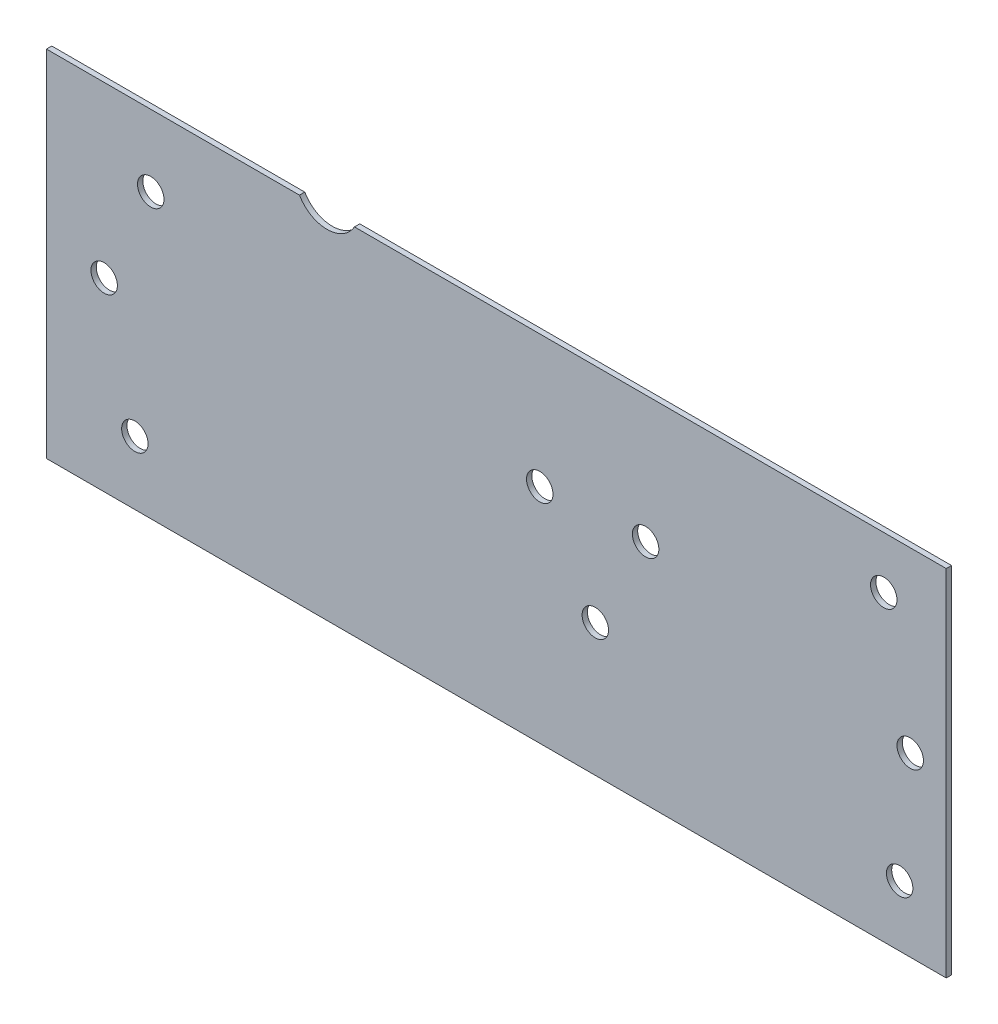
ISO-10303-21;
HEADER;
FILE_DESCRIPTION(('STEP AP214'),'2;1');
FILE_NAME('part.step','',(''),(''),'','','');
FILE_SCHEMA(('AUTOMOTIVE_DESIGN { 1 0 10303 214 1 1 1 1 }'));
ENDSEC;
DATA;
#1=APPLICATION_CONTEXT('core data for automotive mechanical design processes');
#2=APPLICATION_PROTOCOL_DEFINITION('international standard','automotive_design',2000,#1);
#3=PRODUCT_CONTEXT('',#1,'mechanical');
#4=PRODUCT('Part','Part','',(#3));
#5=PRODUCT_RELATED_PRODUCT_CATEGORY('part','',(#4));
#6=PRODUCT_DEFINITION_FORMATION('','',#4);
#7=PRODUCT_DEFINITION_CONTEXT('part definition',#1,'design');
#8=PRODUCT_DEFINITION('design','',#6,#7);
#9=PRODUCT_DEFINITION_SHAPE('','',#8);
#10=(LENGTH_UNIT() NAMED_UNIT(*) SI_UNIT(.MILLI.,.METRE.));
#11=(NAMED_UNIT(*) PLANE_ANGLE_UNIT() SI_UNIT($,.RADIAN.));
#12=(NAMED_UNIT(*) SI_UNIT($,.STERADIAN.) SOLID_ANGLE_UNIT());
#13=UNCERTAINTY_MEASURE_WITH_UNIT(LENGTH_MEASURE(1.E-05),#10,'distance_accuracy_value','');
#14=(GEOMETRIC_REPRESENTATION_CONTEXT(3) GLOBAL_UNCERTAINTY_ASSIGNED_CONTEXT((#13)) GLOBAL_UNIT_ASSIGNED_CONTEXT((#10,
#11,#12)) REPRESENTATION_CONTEXT('',''));
#15=CARTESIAN_POINT('',(0.,0.,0.));
#16=DIRECTION('',(0.,0.,1.));
#17=DIRECTION('',(1.,0.,0.));
#18=AXIS2_PLACEMENT_3D('',#15,#16,#17);
#19=CARTESIAN_POINT('',(-32.,36.5,1.));
#20=DIRECTION('',(0.,0.,-1.));
#21=DIRECTION('',(-1.,0.,0.));
#22=AXIS2_PLACEMENT_3D('',#19,#20,#21);
#23=CYLINDRICAL_SURFACE('',#22,6.);
#24=CARTESIAN_POINT('',(-32.,36.5,0.));
#25=DIRECTION('',(0.,0.,1.));
#26=DIRECTION('',(1.,0.,0.));
#27=AXIS2_PLACEMENT_3D('',#24,#25,#26);
#28=CIRCLE('',#27,6.);
#29=CARTESIAN_POINT('',(-37.1961524227066,33.5,0.));
#30=VERTEX_POINT('',#29);
#31=CARTESIAN_POINT('',(-26.8038475772934,33.5,0.));
#32=VERTEX_POINT('',#31);
#33=EDGE_CURVE('E149',#30,#32,#28,.T.);
#34=ORIENTED_EDGE('',*,*,#33,.F.);
#35=DIRECTION('',(0.,0.,-1.));
#36=VECTOR('',#35,1.);
#37=CARTESIAN_POINT('',(-37.1961524227066,33.5,1.));
#38=LINE('',#37,#36);
#39=CARTESIAN_POINT('',(-37.1961524227066,33.5,1.));
#40=VERTEX_POINT('',#39);
#41=EDGE_CURVE('E11',#40,#30,#38,.T.);
#42=ORIENTED_EDGE('',*,*,#41,.F.);
#43=CARTESIAN_POINT('',(-32.,36.5,1.));
#44=DIRECTION('',(0.,0.,1.));
#45=DIRECTION('',(1.,0.,0.));
#46=AXIS2_PLACEMENT_3D('',#43,#44,#45);
#47=CIRCLE('',#46,6.);
#48=CARTESIAN_POINT('',(-26.8038475772934,33.5,1.));
#49=VERTEX_POINT('',#48);
#50=EDGE_CURVE('E188',#40,#49,#47,.T.);
#51=ORIENTED_EDGE('',*,*,#50,.T.);
#52=DIRECTION('',(0.,0.,-1.));
#53=VECTOR('',#52,1.);
#54=CARTESIAN_POINT('',(-26.8038475772934,33.5,1.));
#55=LINE('',#54,#53);
#56=EDGE_CURVE('E55',#49,#32,#55,.T.);
#57=ORIENTED_EDGE('',*,*,#56,.T.);
#58=EDGE_LOOP('',(#34,#42,#51,#57));
#59=FACE_BOUND('',#58,.T.);
#60=ADVANCED_FACE('F39',(#59),#23,.F.);
#61=CARTESIAN_POINT('',(0.,33.5,1.));
#62=DIRECTION('',(0.,1.,0.));
#63=DIRECTION('',(0.,0.,1.));
#64=AXIS2_PLACEMENT_3D('',#61,#62,#63);
#65=PLANE('',#64);
#66=DIRECTION('',(1.,0.,0.));
#67=VECTOR('',#66,1.);
#68=CARTESIAN_POINT('',(0.,33.5,0.));
#69=LINE('',#68,#67);
#70=CARTESIAN_POINT('',(-85.,33.5,0.));
#71=VERTEX_POINT('',#70);
#72=EDGE_CURVE('E151',#71,#30,#69,.T.);
#73=ORIENTED_EDGE('',*,*,#72,.F.);
#74=DIRECTION('',(0.,0.,-1.));
#75=VECTOR('',#74,1.);
#76=CARTESIAN_POINT('',(-85.,33.5,1.));
#77=LINE('',#76,#75);
#78=CARTESIAN_POINT('',(-85.,33.5,1.));
#79=VERTEX_POINT('',#78);
#80=EDGE_CURVE('E47',#79,#71,#77,.T.);
#81=ORIENTED_EDGE('',*,*,#80,.F.);
#82=DIRECTION('',(1.,0.,0.));
#83=VECTOR('',#82,1.);
#84=CARTESIAN_POINT('',(0.,33.5,1.));
#85=LINE('',#84,#83);
#86=EDGE_CURVE('E120',#79,#40,#85,.T.);
#87=ORIENTED_EDGE('',*,*,#86,.T.);
#88=ORIENTED_EDGE('',*,*,#41,.T.);
#89=EDGE_LOOP('',(#73,#81,#87,#88));
#90=FACE_BOUND('',#89,.T.);
#91=ADVANCED_FACE('F197',(#90),#65,.T.);
#92=CARTESIAN_POINT('',(-85.,0.,1.));
#93=DIRECTION('',(-1.,0.,0.));
#94=DIRECTION('',(0.,0.,1.));
#95=AXIS2_PLACEMENT_3D('',#92,#93,#94);
#96=PLANE('',#95);
#97=DIRECTION('',(0.,1.,0.));
#98=VECTOR('',#97,1.);
#99=CARTESIAN_POINT('',(-85.,0.,0.));
#100=LINE('',#99,#98);
#101=CARTESIAN_POINT('',(-85.,-33.5,0.));
#102=VERTEX_POINT('',#101);
#103=EDGE_CURVE('E154',#102,#71,#100,.T.);
#104=ORIENTED_EDGE('',*,*,#103,.F.);
#105=DIRECTION('',(0.,0.,-1.));
#106=VECTOR('',#105,1.);
#107=CARTESIAN_POINT('',(-85.,-33.5,1.));
#108=LINE('',#107,#106);
#109=CARTESIAN_POINT('',(-85.,-33.5,1.));
#110=VERTEX_POINT('',#109);
#111=EDGE_CURVE('E113',#110,#102,#108,.T.);
#112=ORIENTED_EDGE('',*,*,#111,.F.);
#113=DIRECTION('',(0.,1.,0.));
#114=VECTOR('',#113,1.);
#115=CARTESIAN_POINT('',(-85.,0.,1.));
#116=LINE('',#115,#114);
#117=EDGE_CURVE('E103',#110,#79,#116,.T.);
#118=ORIENTED_EDGE('',*,*,#117,.T.);
#119=ORIENTED_EDGE('',*,*,#80,.T.);
#120=EDGE_LOOP('',(#104,#112,#118,#119));
#121=FACE_BOUND('',#120,.T.);
#122=ADVANCED_FACE('F194',(#121),#96,.T.);
#123=CARTESIAN_POINT('',(0.,-33.5,1.));
#124=DIRECTION('',(0.,1.,0.));
#125=DIRECTION('',(0.,0.,1.));
#126=AXIS2_PLACEMENT_3D('',#123,#124,#125);
#127=PLANE('',#126);
#128=DIRECTION('',(1.,0.,0.));
#129=VECTOR('',#128,1.);
#130=CARTESIAN_POINT('',(0.,-33.5,0.));
#131=LINE('',#130,#129);
#132=CARTESIAN_POINT('',(85.,-33.5,0.));
#133=VERTEX_POINT('',#132);
#134=EDGE_CURVE('E110',#102,#133,#131,.T.);
#135=ORIENTED_EDGE('',*,*,#134,.T.);
#136=DIRECTION('',(0.,0.,-1.));
#137=VECTOR('',#136,1.);
#138=CARTESIAN_POINT('',(85.,-33.5,1.));
#139=LINE('',#138,#137);
#140=CARTESIAN_POINT('',(85.,-33.5,1.));
#141=VERTEX_POINT('',#140);
#142=EDGE_CURVE('E107',#141,#133,#139,.T.);
#143=ORIENTED_EDGE('',*,*,#142,.F.);
#144=DIRECTION('',(1.,0.,0.));
#145=VECTOR('',#144,1.);
#146=CARTESIAN_POINT('',(0.,-33.5,1.));
#147=LINE('',#146,#145);
#148=EDGE_CURVE('E94',#110,#141,#147,.T.);
#149=ORIENTED_EDGE('',*,*,#148,.F.);
#150=ORIENTED_EDGE('',*,*,#111,.T.);
#151=EDGE_LOOP('',(#135,#143,#149,#150));
#152=FACE_BOUND('',#151,.T.);
#153=ADVANCED_FACE('F108',(#152),#127,.F.);
#154=CARTESIAN_POINT('',(85.,0.,1.));
#155=DIRECTION('',(-1.,0.,0.));
#156=DIRECTION('',(0.,0.,1.));
#157=AXIS2_PLACEMENT_3D('',#154,#155,#156);
#158=PLANE('',#157);
#159=DIRECTION('',(0.,1.,0.));
#160=VECTOR('',#159,1.);
#161=CARTESIAN_POINT('',(85.,0.,0.));
#162=LINE('',#161,#160);
#163=CARTESIAN_POINT('',(85.,33.5,0.));
#164=VERTEX_POINT('',#163);
#165=EDGE_CURVE('E159',#133,#164,#162,.T.);
#166=ORIENTED_EDGE('',*,*,#165,.T.);
#167=DIRECTION('',(0.,0.,-1.));
#168=VECTOR('',#167,1.);
#169=CARTESIAN_POINT('',(85.,33.5,1.));
#170=LINE('',#169,#168);
#171=CARTESIAN_POINT('',(85.,33.5,1.));
#172=VERTEX_POINT('',#171);
#173=EDGE_CURVE('E75',#172,#164,#170,.T.);
#174=ORIENTED_EDGE('',*,*,#173,.F.);
#175=DIRECTION('',(0.,1.,0.));
#176=VECTOR('',#175,1.);
#177=CARTESIAN_POINT('',(85.,0.,1.));
#178=LINE('',#177,#176);
#179=EDGE_CURVE('E100',#141,#172,#178,.T.);
#180=ORIENTED_EDGE('',*,*,#179,.F.);
#181=ORIENTED_EDGE('',*,*,#142,.T.);
#182=EDGE_LOOP('',(#166,#174,#180,#181));
#183=FACE_BOUND('',#182,.T.);
#184=ADVANCED_FACE('F115',(#183),#158,.F.);
#185=CARTESIAN_POINT('',(28.2,9.50000000000001,1.));
#186=DIRECTION('',(0.,0.,-1.));
#187=DIRECTION('',(-1.,0.,0.));
#188=AXIS2_PLACEMENT_3D('',#185,#186,#187);
#189=CYLINDRICAL_SURFACE('',#188,2.5);
#190=CARTESIAN_POINT('',(28.2,9.50000000000001,1.));
#191=DIRECTION('',(0.,0.,1.));
#192=DIRECTION('',(1.,0.,0.));
#193=AXIS2_PLACEMENT_3D('',#190,#191,#192);
#194=CIRCLE('',#193,2.5);
#195=CARTESIAN_POINT('',(30.7,9.50000000000001,1.));
#196=VERTEX_POINT('',#195);
#197=EDGE_CURVE('E143',#196,#196,#194,.T.);
#198=ORIENTED_EDGE('',*,*,#197,.T.);
#199=EDGE_LOOP('',(#198));
#200=FACE_BOUND('',#199,.T.);
#201=CARTESIAN_POINT('',(28.2,9.50000000000001,0.));
#202=DIRECTION('',(0.,0.,1.));
#203=DIRECTION('',(1.,0.,0.));
#204=AXIS2_PLACEMENT_3D('',#201,#202,#203);
#205=CIRCLE('',#204,2.5);
#206=CARTESIAN_POINT('',(30.7,9.50000000000001,0.));
#207=VERTEX_POINT('',#206);
#208=EDGE_CURVE('E182',#207,#207,#205,.T.);
#209=ORIENTED_EDGE('',*,*,#208,.F.);
#210=EDGE_LOOP('',(#209));
#211=FACE_BOUND('',#210,.T.);
#212=ADVANCED_FACE('F242',(#200,#211),#189,.F.);
#213=CARTESIAN_POINT('',(18.7,-8.49999999999999,1.));
#214=DIRECTION('',(0.,0.,-1.));
#215=DIRECTION('',(-1.,0.,0.));
#216=AXIS2_PLACEMENT_3D('',#213,#214,#215);
#217=CYLINDRICAL_SURFACE('',#216,2.5);
#218=CARTESIAN_POINT('',(18.7,-8.49999999999999,1.));
#219=DIRECTION('',(0.,0.,1.));
#220=DIRECTION('',(1.,0.,0.));
#221=AXIS2_PLACEMENT_3D('',#218,#219,#220);
#222=CIRCLE('',#221,2.5);
#223=CARTESIAN_POINT('',(21.2,-8.49999999999999,1.));
#224=VERTEX_POINT('',#223);
#225=EDGE_CURVE('E140',#224,#224,#222,.T.);
#226=ORIENTED_EDGE('',*,*,#225,.T.);
#227=EDGE_LOOP('',(#226));
#228=FACE_BOUND('',#227,.T.);
#229=CARTESIAN_POINT('',(18.7,-8.49999999999999,0.));
#230=DIRECTION('',(0.,0.,1.));
#231=DIRECTION('',(1.,0.,0.));
#232=AXIS2_PLACEMENT_3D('',#229,#230,#231);
#233=CIRCLE('',#232,2.5);
#234=CARTESIAN_POINT('',(21.2,-8.49999999999999,0.));
#235=VERTEX_POINT('',#234);
#236=EDGE_CURVE('E179',#235,#235,#233,.T.);
#237=ORIENTED_EDGE('',*,*,#236,.F.);
#238=EDGE_LOOP('',(#237));
#239=FACE_BOUND('',#238,.T.);
#240=ADVANCED_FACE('F248',(#228,#239),#217,.F.);
#241=CARTESIAN_POINT('',(73.2,23.7,1.));
#242=DIRECTION('',(0.,0.,-1.));
#243=DIRECTION('',(-1.,0.,0.));
#244=AXIS2_PLACEMENT_3D('',#241,#242,#243);
#245=CYLINDRICAL_SURFACE('',#244,2.50000000000001);
#246=CARTESIAN_POINT('',(73.2,23.7,1.));
#247=DIRECTION('',(0.,0.,1.));
#248=DIRECTION('',(1.,0.,0.));
#249=AXIS2_PLACEMENT_3D('',#246,#247,#248);
#250=CIRCLE('',#249,2.50000000000001);
#251=CARTESIAN_POINT('',(75.7,23.7,1.));
#252=VERTEX_POINT('',#251);
#253=EDGE_CURVE('E137',#252,#252,#250,.T.);
#254=ORIENTED_EDGE('',*,*,#253,.T.);
#255=EDGE_LOOP('',(#254));
#256=FACE_BOUND('',#255,.T.);
#257=CARTESIAN_POINT('',(73.2,23.7,0.));
#258=DIRECTION('',(0.,0.,1.));
#259=DIRECTION('',(1.,0.,0.));
#260=AXIS2_PLACEMENT_3D('',#257,#258,#259);
#261=CIRCLE('',#260,2.50000000000001);
#262=CARTESIAN_POINT('',(75.7,23.7,0.));
#263=VERTEX_POINT('',#262);
#264=EDGE_CURVE('E176',#263,#263,#261,.T.);
#265=ORIENTED_EDGE('',*,*,#264,.F.);
#266=EDGE_LOOP('',(#265));
#267=FACE_BOUND('',#266,.T.);
#268=ADVANCED_FACE('F256',(#256,#267),#245,.F.);
#269=CARTESIAN_POINT('',(78.2,-0.100000000000003,1.));
#270=DIRECTION('',(0.,0.,-1.));
#271=DIRECTION('',(-1.,0.,0.));
#272=AXIS2_PLACEMENT_3D('',#269,#270,#271);
#273=CYLINDRICAL_SURFACE('',#272,2.50000000000001);
#274=CARTESIAN_POINT('',(78.2,-0.100000000000003,1.));
#275=DIRECTION('',(0.,0.,1.));
#276=DIRECTION('',(1.,0.,0.));
#277=AXIS2_PLACEMENT_3D('',#274,#275,#276);
#278=CIRCLE('',#277,2.50000000000001);
#279=CARTESIAN_POINT('',(80.7,-0.100000000000003,1.));
#280=VERTEX_POINT('',#279);
#281=EDGE_CURVE('E134',#280,#280,#278,.T.);
#282=ORIENTED_EDGE('',*,*,#281,.T.);
#283=EDGE_LOOP('',(#282));
#284=FACE_BOUND('',#283,.T.);
#285=CARTESIAN_POINT('',(78.2,-0.100000000000003,0.));
#286=DIRECTION('',(0.,0.,1.));
#287=DIRECTION('',(1.,0.,0.));
#288=AXIS2_PLACEMENT_3D('',#285,#286,#287);
#289=CIRCLE('',#288,2.50000000000001);
#290=CARTESIAN_POINT('',(80.7,-0.100000000000003,0.));
#291=VERTEX_POINT('',#290);
#292=EDGE_CURVE('E173',#291,#291,#289,.T.);
#293=ORIENTED_EDGE('',*,*,#292,.F.);
#294=EDGE_LOOP('',(#293));
#295=FACE_BOUND('',#294,.T.);
#296=ADVANCED_FACE('F264',(#284,#295),#273,.F.);
#297=CARTESIAN_POINT('',(76.2,-22.,1.));
#298=DIRECTION('',(0.,0.,-1.));
#299=DIRECTION('',(-1.,0.,0.));
#300=AXIS2_PLACEMENT_3D('',#297,#298,#299);
#301=CYLINDRICAL_SURFACE('',#300,2.50000000000001);
#302=CARTESIAN_POINT('',(76.2,-22.,1.));
#303=DIRECTION('',(0.,0.,1.));
#304=DIRECTION('',(1.,0.,0.));
#305=AXIS2_PLACEMENT_3D('',#302,#303,#304);
#306=CIRCLE('',#305,2.50000000000001);
#307=CARTESIAN_POINT('',(78.7,-22.,1.));
#308=VERTEX_POINT('',#307);
#309=EDGE_CURVE('E131',#308,#308,#306,.T.);
#310=ORIENTED_EDGE('',*,*,#309,.T.);
#311=EDGE_LOOP('',(#310));
#312=FACE_BOUND('',#311,.T.);
#313=CARTESIAN_POINT('',(76.2,-22.,0.));
#314=DIRECTION('',(0.,0.,1.));
#315=DIRECTION('',(1.,0.,0.));
#316=AXIS2_PLACEMENT_3D('',#313,#314,#315);
#317=CIRCLE('',#316,2.50000000000001);
#318=CARTESIAN_POINT('',(78.7,-22.,0.));
#319=VERTEX_POINT('',#318);
#320=EDGE_CURVE('E170',#319,#319,#317,.T.);
#321=ORIENTED_EDGE('',*,*,#320,.F.);
#322=EDGE_LOOP('',(#321));
#323=FACE_BOUND('',#322,.T.);
#324=ADVANCED_FACE('F272',(#312,#323),#301,.F.);
#325=CARTESIAN_POINT('',(-68.3,-21.5,1.));
#326=DIRECTION('',(0.,0.,-1.));
#327=DIRECTION('',(-1.,0.,0.));
#328=AXIS2_PLACEMENT_3D('',#325,#326,#327);
#329=CYLINDRICAL_SURFACE('',#328,2.49999999999999);
#330=CARTESIAN_POINT('',(-68.3,-21.5,1.));
#331=DIRECTION('',(0.,0.,1.));
#332=DIRECTION('',(1.,0.,0.));
#333=AXIS2_PLACEMENT_3D('',#330,#331,#332);
#334=CIRCLE('',#333,2.49999999999999);
#335=CARTESIAN_POINT('',(-65.8,-21.5,1.));
#336=VERTEX_POINT('',#335);
#337=EDGE_CURVE('E128',#336,#336,#334,.T.);
#338=ORIENTED_EDGE('',*,*,#337,.T.);
#339=EDGE_LOOP('',(#338));
#340=FACE_BOUND('',#339,.T.);
#341=CARTESIAN_POINT('',(-68.3,-21.5,0.));
#342=DIRECTION('',(0.,0.,1.));
#343=DIRECTION('',(1.,0.,0.));
#344=AXIS2_PLACEMENT_3D('',#341,#342,#343);
#345=CIRCLE('',#344,2.49999999999999);
#346=CARTESIAN_POINT('',(-65.8,-21.5,0.));
#347=VERTEX_POINT('',#346);
#348=EDGE_CURVE('E167',#347,#347,#345,.T.);
#349=ORIENTED_EDGE('',*,*,#348,.F.);
#350=EDGE_LOOP('',(#349));
#351=FACE_BOUND('',#350,.T.);
#352=ADVANCED_FACE('F280',(#340,#351),#329,.F.);
#353=CARTESIAN_POINT('',(-74.1,1.5,1.));
#354=DIRECTION('',(0.,0.,-1.));
#355=DIRECTION('',(-1.,0.,0.));
#356=AXIS2_PLACEMENT_3D('',#353,#354,#355);
#357=CYLINDRICAL_SURFACE('',#356,2.49999999999999);
#358=CARTESIAN_POINT('',(-74.1,1.5,1.));
#359=DIRECTION('',(0.,0.,1.));
#360=DIRECTION('',(1.,0.,0.));
#361=AXIS2_PLACEMENT_3D('',#358,#359,#360);
#362=CIRCLE('',#361,2.49999999999999);
#363=CARTESIAN_POINT('',(-71.6,1.5,1.));
#364=VERTEX_POINT('',#363);
#365=EDGE_CURVE('E125',#364,#364,#362,.T.);
#366=ORIENTED_EDGE('',*,*,#365,.T.);
#367=EDGE_LOOP('',(#366));
#368=FACE_BOUND('',#367,.T.);
#369=CARTESIAN_POINT('',(-74.1,1.5,0.));
#370=DIRECTION('',(0.,0.,1.));
#371=DIRECTION('',(1.,0.,0.));
#372=AXIS2_PLACEMENT_3D('',#369,#370,#371);
#373=CIRCLE('',#372,2.49999999999999);
#374=CARTESIAN_POINT('',(-71.6,1.5,0.));
#375=VERTEX_POINT('',#374);
#376=EDGE_CURVE('E164',#375,#375,#373,.T.);
#377=ORIENTED_EDGE('',*,*,#376,.F.);
#378=EDGE_LOOP('',(#377));
#379=FACE_BOUND('',#378,.T.);
#380=ADVANCED_FACE('F213',(#368,#379),#357,.F.);
#381=CARTESIAN_POINT('',(-65.3,20.,1.));
#382=DIRECTION('',(0.,0.,-1.));
#383=DIRECTION('',(-1.,0.,0.));
#384=AXIS2_PLACEMENT_3D('',#381,#382,#383);
#385=CYLINDRICAL_SURFACE('',#384,2.50000000000001);
#386=CARTESIAN_POINT('',(-65.3,20.,1.));
#387=DIRECTION('',(0.,0.,1.));
#388=DIRECTION('',(1.,0.,0.));
#389=AXIS2_PLACEMENT_3D('',#386,#387,#388);
#390=CIRCLE('',#389,2.50000000000001);
#391=CARTESIAN_POINT('',(-62.8,20.,1.));
#392=VERTEX_POINT('',#391);
#393=EDGE_CURVE('E118',#392,#392,#390,.T.);
#394=ORIENTED_EDGE('',*,*,#393,.T.);
#395=EDGE_LOOP('',(#394));
#396=FACE_BOUND('',#395,.T.);
#397=CARTESIAN_POINT('',(-65.3,20.,0.));
#398=DIRECTION('',(0.,0.,1.));
#399=DIRECTION('',(1.,0.,0.));
#400=AXIS2_PLACEMENT_3D('',#397,#398,#399);
#401=CIRCLE('',#400,2.50000000000001);
#402=CARTESIAN_POINT('',(-62.8,20.,0.));
#403=VERTEX_POINT('',#402);
#404=EDGE_CURVE('E161',#403,#403,#401,.T.);
#405=ORIENTED_EDGE('',*,*,#404,.F.);
#406=EDGE_LOOP('',(#405));
#407=FACE_BOUND('',#406,.T.);
#408=ADVANCED_FACE('F205',(#396,#407),#385,.F.);
#409=EDGE_CURVE('E155',#32,#164,#69,.T.);
#410=ORIENTED_EDGE('',*,*,#409,.F.);
#411=ORIENTED_EDGE('',*,*,#56,.F.);
#412=EDGE_CURVE('E116',#49,#172,#85,.T.);
#413=ORIENTED_EDGE('',*,*,#412,.T.);
#414=ORIENTED_EDGE('',*,*,#173,.T.);
#415=EDGE_LOOP('',(#410,#411,#413,#414));
#416=FACE_BOUND('',#415,.T.);
#417=ADVANCED_FACE('F202',(#416),#65,.T.);
#418=CARTESIAN_POINT('',(8.20000000000003,8.50000000000001,1.));
#419=DIRECTION('',(0.,0.,-1.));
#420=DIRECTION('',(-1.,0.,0.));
#421=AXIS2_PLACEMENT_3D('',#418,#419,#420);
#422=CYLINDRICAL_SURFACE('',#421,2.5);
#423=CARTESIAN_POINT('',(8.20000000000003,8.50000000000001,1.));
#424=DIRECTION('',(0.,0.,1.));
#425=DIRECTION('',(1.,0.,0.));
#426=AXIS2_PLACEMENT_3D('',#423,#424,#425);
#427=CIRCLE('',#426,2.5);
#428=CARTESIAN_POINT('',(10.7,8.50000000000001,1.));
#429=VERTEX_POINT('',#428);
#430=EDGE_CURVE('E146',#429,#429,#427,.T.);
#431=ORIENTED_EDGE('',*,*,#430,.T.);
#432=EDGE_LOOP('',(#431));
#433=FACE_BOUND('',#432,.T.);
#434=CARTESIAN_POINT('',(8.20000000000003,8.50000000000001,0.));
#435=DIRECTION('',(0.,0.,1.));
#436=DIRECTION('',(1.,0.,0.));
#437=AXIS2_PLACEMENT_3D('',#434,#435,#436);
#438=CIRCLE('',#437,2.5);
#439=CARTESIAN_POINT('',(10.7,8.50000000000001,0.));
#440=VERTEX_POINT('',#439);
#441=EDGE_CURVE('E185',#440,#440,#438,.T.);
#442=ORIENTED_EDGE('',*,*,#441,.F.);
#443=EDGE_LOOP('',(#442));
#444=FACE_BOUND('',#443,.T.);
#445=ADVANCED_FACE('F204',(#433,#444),#422,.F.);
#446=CARTESIAN_POINT('',(0.,0.,1.));
#447=DIRECTION('',(0.,0.,1.));
#448=DIRECTION('',(1.,0.,0.));
#449=AXIS2_PLACEMENT_3D('',#446,#447,#448);
#450=PLANE('',#449);
#451=ORIENTED_EDGE('',*,*,#50,.F.);
#452=ORIENTED_EDGE('',*,*,#86,.F.);
#453=ORIENTED_EDGE('',*,*,#117,.F.);
#454=ORIENTED_EDGE('',*,*,#148,.T.);
#455=ORIENTED_EDGE('',*,*,#179,.T.);
#456=ORIENTED_EDGE('',*,*,#412,.F.);
#457=EDGE_LOOP('',(#451,#452,#453,#454,#455,#456));
#458=FACE_BOUND('',#457,.T.);
#459=ORIENTED_EDGE('',*,*,#393,.F.);
#460=EDGE_LOOP('',(#459));
#461=FACE_BOUND('',#460,.T.);
#462=ORIENTED_EDGE('',*,*,#365,.F.);
#463=EDGE_LOOP('',(#462));
#464=FACE_BOUND('',#463,.T.);
#465=ORIENTED_EDGE('',*,*,#337,.F.);
#466=EDGE_LOOP('',(#465));
#467=FACE_BOUND('',#466,.T.);
#468=ORIENTED_EDGE('',*,*,#309,.F.);
#469=EDGE_LOOP('',(#468));
#470=FACE_BOUND('',#469,.T.);
#471=ORIENTED_EDGE('',*,*,#281,.F.);
#472=EDGE_LOOP('',(#471));
#473=FACE_BOUND('',#472,.T.);
#474=ORIENTED_EDGE('',*,*,#253,.F.);
#475=EDGE_LOOP('',(#474));
#476=FACE_BOUND('',#475,.T.);
#477=ORIENTED_EDGE('',*,*,#225,.F.);
#478=EDGE_LOOP('',(#477));
#479=FACE_BOUND('',#478,.T.);
#480=ORIENTED_EDGE('',*,*,#197,.F.);
#481=EDGE_LOOP('',(#480));
#482=FACE_BOUND('',#481,.T.);
#483=ORIENTED_EDGE('',*,*,#430,.F.);
#484=EDGE_LOOP('',(#483));
#485=FACE_BOUND('',#484,.T.);
#486=ADVANCED_FACE('F96',(#458,#461,#464,#467,#470,#473,#476,#479,#482,#485),#450,.T.);
#487=CARTESIAN_POINT('',(0.,0.,0.));
#488=DIRECTION('',(0.,0.,1.));
#489=DIRECTION('',(1.,0.,0.));
#490=AXIS2_PLACEMENT_3D('',#487,#488,#489);
#491=PLANE('',#490);
#492=ORIENTED_EDGE('',*,*,#33,.T.);
#493=ORIENTED_EDGE('',*,*,#409,.T.);
#494=ORIENTED_EDGE('',*,*,#165,.F.);
#495=ORIENTED_EDGE('',*,*,#134,.F.);
#496=ORIENTED_EDGE('',*,*,#103,.T.);
#497=ORIENTED_EDGE('',*,*,#72,.T.);
#498=EDGE_LOOP('',(#492,#493,#494,#495,#496,#497));
#499=FACE_BOUND('',#498,.T.);
#500=ORIENTED_EDGE('',*,*,#404,.T.);
#501=EDGE_LOOP('',(#500));
#502=FACE_BOUND('',#501,.T.);
#503=ORIENTED_EDGE('',*,*,#376,.T.);
#504=EDGE_LOOP('',(#503));
#505=FACE_BOUND('',#504,.T.);
#506=ORIENTED_EDGE('',*,*,#348,.T.);
#507=EDGE_LOOP('',(#506));
#508=FACE_BOUND('',#507,.T.);
#509=ORIENTED_EDGE('',*,*,#320,.T.);
#510=EDGE_LOOP('',(#509));
#511=FACE_BOUND('',#510,.T.);
#512=ORIENTED_EDGE('',*,*,#292,.T.);
#513=EDGE_LOOP('',(#512));
#514=FACE_BOUND('',#513,.T.);
#515=ORIENTED_EDGE('',*,*,#264,.T.);
#516=EDGE_LOOP('',(#515));
#517=FACE_BOUND('',#516,.T.);
#518=ORIENTED_EDGE('',*,*,#236,.T.);
#519=EDGE_LOOP('',(#518));
#520=FACE_BOUND('',#519,.T.);
#521=ORIENTED_EDGE('',*,*,#208,.T.);
#522=EDGE_LOOP('',(#521));
#523=FACE_BOUND('',#522,.T.);
#524=ORIENTED_EDGE('',*,*,#441,.T.);
#525=EDGE_LOOP('',(#524));
#526=FACE_BOUND('',#525,.T.);
#527=ADVANCED_FACE('F199',(#499,#502,#505,#508,#511,#514,#517,#520,#523,#526),#491,.F.);
#528=CLOSED_SHELL('',(#60,#91,#122,#153,#184,#212,#240,#268,#296,#324,#352,#380,#408,#417,#445,
#486,#527));
#529=MANIFOLD_SOLID_BREP('B2',#528);
#530=ADVANCED_BREP_SHAPE_REPRESENTATION('',(#18,#529),#14);
#531=SHAPE_DEFINITION_REPRESENTATION(#9,#530);
ENDSEC;
END-ISO-10303-21;
